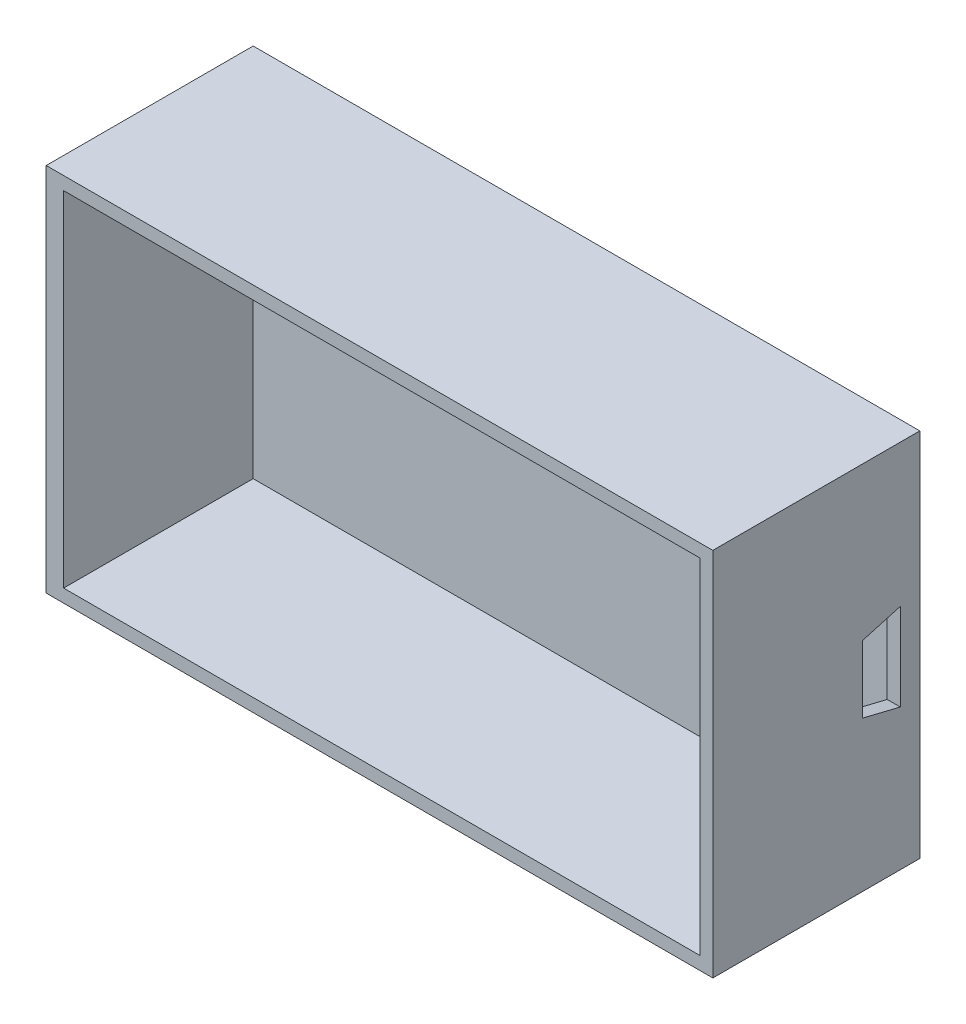
ISO-10303-21;
HEADER;
FILE_DESCRIPTION(('STEP AP214'),'2;1');
FILE_NAME('part.step','',(''),(''),'','','');
FILE_SCHEMA(('AUTOMOTIVE_DESIGN { 1 0 10303 214 1 1 1 1 }'));
ENDSEC;
DATA;
#1=APPLICATION_CONTEXT('core data for automotive mechanical design processes');
#2=APPLICATION_PROTOCOL_DEFINITION('international standard','automotive_design',2000,#1);
#3=PRODUCT_CONTEXT('',#1,'mechanical');
#4=PRODUCT('Part','Part','',(#3));
#5=PRODUCT_RELATED_PRODUCT_CATEGORY('part','',(#4));
#6=PRODUCT_DEFINITION_FORMATION('','',#4);
#7=PRODUCT_DEFINITION_CONTEXT('part definition',#1,'design');
#8=PRODUCT_DEFINITION('design','',#6,#7);
#9=PRODUCT_DEFINITION_SHAPE('','',#8);
#10=(LENGTH_UNIT() NAMED_UNIT(*) SI_UNIT(.MILLI.,.METRE.));
#11=(NAMED_UNIT(*) PLANE_ANGLE_UNIT() SI_UNIT($,.RADIAN.));
#12=(NAMED_UNIT(*) SI_UNIT($,.STERADIAN.) SOLID_ANGLE_UNIT());
#13=UNCERTAINTY_MEASURE_WITH_UNIT(LENGTH_MEASURE(1.E-05),#10,'distance_accuracy_value','');
#14=(GEOMETRIC_REPRESENTATION_CONTEXT(3) GLOBAL_UNCERTAINTY_ASSIGNED_CONTEXT((#13)) GLOBAL_UNIT_ASSIGNED_CONTEXT((#10,
#11,#12)) REPRESENTATION_CONTEXT('',''));
#15=CARTESIAN_POINT('',(0.,0.,0.));
#16=DIRECTION('',(0.,0.,1.));
#17=DIRECTION('',(1.,0.,0.));
#18=AXIS2_PLACEMENT_3D('',#15,#16,#17);
#19=CARTESIAN_POINT('',(58.4,0.,19.));
#20=DIRECTION('',(0.,1.,0.));
#21=DIRECTION('',(0.,0.,1.));
#22=AXIS2_PLACEMENT_3D('',#19,#20,#21);
#23=PLANE('',#22);
#24=DIRECTION('',(0.,0.,-1.));
#25=VECTOR('',#24,1.);
#26=CARTESIAN_POINT('',(58.4,0.,19.));
#27=LINE('',#26,#25);
#28=CARTESIAN_POINT('',(58.4,0.,19.));
#29=VERTEX_POINT('',#28);
#30=CARTESIAN_POINT('',(58.4,0.,1.6));
#31=VERTEX_POINT('',#30);
#32=EDGE_CURVE('E212',#29,#31,#27,.T.);
#33=ORIENTED_EDGE('',*,*,#32,.T.);
#34=DIRECTION('',(1.,0.,0.));
#35=VECTOR('',#34,1.);
#36=CARTESIAN_POINT('',(58.4,0.,1.6));
#37=LINE('',#36,#35);
#38=CARTESIAN_POINT('',(0.,0.,1.6));
#39=VERTEX_POINT('',#38);
#40=EDGE_CURVE('E178',#39,#31,#37,.T.);
#41=ORIENTED_EDGE('',*,*,#40,.F.);
#42=DIRECTION('',(0.,0.,-1.));
#43=VECTOR('',#42,1.);
#44=CARTESIAN_POINT('',(0.,0.,19.));
#45=LINE('',#44,#43);
#46=CARTESIAN_POINT('',(0.,0.,19.));
#47=VERTEX_POINT('',#46);
#48=EDGE_CURVE('E200',#47,#39,#45,.T.);
#49=ORIENTED_EDGE('',*,*,#48,.F.);
#50=DIRECTION('',(1.,0.,0.));
#51=VECTOR('',#50,1.);
#52=CARTESIAN_POINT('',(58.4,0.,19.));
#53=LINE('',#52,#51);
#54=EDGE_CURVE('E187',#47,#29,#53,.T.);
#55=ORIENTED_EDGE('',*,*,#54,.T.);
#56=EDGE_LOOP('',(#33,#41,#49,#55));
#57=FACE_BOUND('',#56,.T.);
#58=ADVANCED_FACE('F39',(#57),#23,.T.);
#59=CARTESIAN_POINT('',(58.4,31.6,19.));
#60=DIRECTION('',(-1.,0.,0.));
#61=DIRECTION('',(0.,0.,1.));
#62=AXIS2_PLACEMENT_3D('',#59,#60,#61);
#63=PLANE('',#62);
#64=DIRECTION('',(0.,-1.,0.));
#65=VECTOR('',#64,1.);
#66=CARTESIAN_POINT('',(58.4,31.6,1.79014940310975));
#67=LINE('',#66,#65);
#68=CARTESIAN_POINT('',(58.4,19.7419828381159,1.79014940310974));
#69=VERTEX_POINT('',#68);
#70=CARTESIAN_POINT('',(58.4,11.7419828381159,1.79014940310974));
#71=VERTEX_POINT('',#70);
#72=EDGE_CURVE('E172',#69,#71,#67,.T.);
#73=ORIENTED_EDGE('',*,*,#72,.F.);
#74=DIRECTION('',(0.,0.2723630723258,-0.962194552485749));
#75=VECTOR('',#74,1.);
#76=CARTESIAN_POINT('',(58.4,16.1115087775231,14.6157587421932));
#77=LINE('',#76,#75);
#78=CARTESIAN_POINT('',(58.4,18.7544498385254,5.27887077965979));
#79=VERTEX_POINT('',#78);
#80=EDGE_CURVE('E160',#79,#69,#77,.T.);
#81=ORIENTED_EDGE('',*,*,#80,.F.);
#82=DIRECTION('',(0.,1.,0.));
#83=VECTOR('',#82,1.);
#84=CARTESIAN_POINT('',(58.4,31.6,5.27887077965979));
#85=LINE('',#84,#83);
#86=CARTESIAN_POINT('',(58.4,12.594196568005,5.27887077965978));
#87=VERTEX_POINT('',#86);
#88=EDGE_CURVE('E135',#87,#79,#85,.T.);
#89=ORIENTED_EDGE('',*,*,#88,.F.);
#90=DIRECTION('',(0.,0.237299423470381,0.97143655666267));
#91=VECTOR('',#90,1.);
#92=CARTESIAN_POINT('',(58.4,16.8274456996713,22.608592444468));
#93=LINE('',#92,#91);
#94=EDGE_CURVE('E169',#71,#87,#93,.T.);
#95=ORIENTED_EDGE('',*,*,#94,.F.);
#96=EDGE_LOOP('',(#73,#81,#89,#95));
#97=FACE_BOUND('',#96,.T.);
#98=DIRECTION('',(0.,0.,-1.));
#99=VECTOR('',#98,1.);
#100=CARTESIAN_POINT('',(58.4,31.6,19.));
#101=LINE('',#100,#99);
#102=CARTESIAN_POINT('',(58.4,31.6,19.));
#103=VERTEX_POINT('',#102);
#104=CARTESIAN_POINT('',(58.4,31.6,1.6));
#105=VERTEX_POINT('',#104);
#106=EDGE_CURVE('E208',#103,#105,#101,.T.);
#107=ORIENTED_EDGE('',*,*,#106,.T.);
#108=DIRECTION('',(0.,1.,0.));
#109=VECTOR('',#108,1.);
#110=CARTESIAN_POINT('',(58.4,31.6,1.6));
#111=LINE('',#110,#109);
#112=EDGE_CURVE('E181',#31,#105,#111,.T.);
#113=ORIENTED_EDGE('',*,*,#112,.F.);
#114=ORIENTED_EDGE('',*,*,#32,.F.);
#115=DIRECTION('',(0.,1.,0.));
#116=VECTOR('',#115,1.);
#117=CARTESIAN_POINT('',(58.4,31.6,19.));
#118=LINE('',#117,#116);
#119=EDGE_CURVE('E190',#29,#103,#118,.T.);
#120=ORIENTED_EDGE('',*,*,#119,.T.);
#121=EDGE_LOOP('',(#107,#113,#114,#120));
#122=FACE_BOUND('',#121,.T.);
#123=ADVANCED_FACE('F284',(#97,#122),#63,.T.);
#124=CARTESIAN_POINT('',(0.,31.6,19.));
#125=DIRECTION('',(0.,-1.,0.));
#126=DIRECTION('',(0.,0.,-1.));
#127=AXIS2_PLACEMENT_3D('',#124,#125,#126);
#128=PLANE('',#127);
#129=DIRECTION('',(0.,0.,-1.));
#130=VECTOR('',#129,1.);
#131=CARTESIAN_POINT('',(0.,31.6,19.));
#132=LINE('',#131,#130);
#133=CARTESIAN_POINT('',(0.,31.6,19.));
#134=VERTEX_POINT('',#133);
#135=CARTESIAN_POINT('',(0.,31.6,1.6));
#136=VERTEX_POINT('',#135);
#137=EDGE_CURVE('E204',#134,#136,#132,.T.);
#138=ORIENTED_EDGE('',*,*,#137,.T.);
#139=DIRECTION('',(-1.,0.,0.));
#140=VECTOR('',#139,1.);
#141=CARTESIAN_POINT('',(0.,31.6,1.6));
#142=LINE('',#141,#140);
#143=EDGE_CURVE('E184',#105,#136,#142,.T.);
#144=ORIENTED_EDGE('',*,*,#143,.F.);
#145=ORIENTED_EDGE('',*,*,#106,.F.);
#146=DIRECTION('',(-1.,0.,0.));
#147=VECTOR('',#146,1.);
#148=CARTESIAN_POINT('',(0.,31.6,19.));
#149=LINE('',#148,#147);
#150=EDGE_CURVE('E193',#103,#134,#149,.T.);
#151=ORIENTED_EDGE('',*,*,#150,.T.);
#152=EDGE_LOOP('',(#138,#144,#145,#151));
#153=FACE_BOUND('',#152,.T.);
#154=ADVANCED_FACE('F291',(#153),#128,.T.);
#155=CARTESIAN_POINT('',(0.,0.,19.));
#156=DIRECTION('',(1.,0.,0.));
#157=DIRECTION('',(0.,0.,-1.));
#158=AXIS2_PLACEMENT_3D('',#155,#156,#157);
#159=PLANE('',#158);
#160=ORIENTED_EDGE('',*,*,#48,.T.);
#161=DIRECTION('',(0.,-1.,0.));
#162=VECTOR('',#161,1.);
#163=CARTESIAN_POINT('',(0.,0.,1.6));
#164=LINE('',#163,#162);
#165=EDGE_CURVE('E175',#136,#39,#164,.T.);
#166=ORIENTED_EDGE('',*,*,#165,.F.);
#167=ORIENTED_EDGE('',*,*,#137,.F.);
#168=DIRECTION('',(0.,-1.,0.));
#169=VECTOR('',#168,1.);
#170=CARTESIAN_POINT('',(0.,0.,19.));
#171=LINE('',#170,#169);
#172=EDGE_CURVE('E197',#134,#47,#171,.T.);
#173=ORIENTED_EDGE('',*,*,#172,.T.);
#174=EDGE_LOOP('',(#160,#166,#167,#173));
#175=FACE_BOUND('',#174,.T.);
#176=ADVANCED_FACE('F272',(#175),#159,.T.);
#177=CARTESIAN_POINT('',(0.,0.,19.));
#178=DIRECTION('',(0.,0.,-1.));
#179=DIRECTION('',(-1.,0.,0.));
#180=AXIS2_PLACEMENT_3D('',#177,#178,#179);
#181=PLANE('',#180);
#182=DIRECTION('',(1.,0.,0.));
#183=VECTOR('',#182,1.);
#184=CARTESIAN_POINT('',(59.6,-1.2,19.));
#185=LINE('',#184,#183);
#186=CARTESIAN_POINT('',(-1.6,-1.2,19.));
#187=VERTEX_POINT('',#186);
#188=CARTESIAN_POINT('',(59.6,-1.2,19.));
#189=VERTEX_POINT('',#188);
#190=EDGE_CURVE('E217',#187,#189,#185,.T.);
#191=ORIENTED_EDGE('',*,*,#190,.T.);
#192=DIRECTION('',(0.,1.,0.));
#193=VECTOR('',#192,1.);
#194=CARTESIAN_POINT('',(59.6,32.8,19.));
#195=LINE('',#194,#193);
#196=CARTESIAN_POINT('',(59.6,32.8,19.));
#197=VERTEX_POINT('',#196);
#198=EDGE_CURVE('E221',#189,#197,#195,.T.);
#199=ORIENTED_EDGE('',*,*,#198,.T.);
#200=DIRECTION('',(-1.,0.,0.));
#201=VECTOR('',#200,1.);
#202=CARTESIAN_POINT('',(0.,32.8,19.));
#203=LINE('',#202,#201);
#204=CARTESIAN_POINT('',(-1.6,32.8,19.));
#205=VERTEX_POINT('',#204);
#206=EDGE_CURVE('E225',#197,#205,#203,.T.);
#207=ORIENTED_EDGE('',*,*,#206,.T.);
#208=DIRECTION('',(0.,-1.,0.));
#209=VECTOR('',#208,1.);
#210=CARTESIAN_POINT('',(-1.6,-1.2,19.));
#211=LINE('',#210,#209);
#212=EDGE_CURVE('E228',#205,#187,#211,.T.);
#213=ORIENTED_EDGE('',*,*,#212,.T.);
#214=EDGE_LOOP('',(#191,#199,#207,#213));
#215=FACE_BOUND('',#214,.T.);
#216=ORIENTED_EDGE('',*,*,#54,.F.);
#217=ORIENTED_EDGE('',*,*,#172,.F.);
#218=ORIENTED_EDGE('',*,*,#150,.F.);
#219=ORIENTED_EDGE('',*,*,#119,.F.);
#220=EDGE_LOOP('',(#216,#217,#218,#219));
#221=FACE_BOUND('',#220,.T.);
#222=ADVANCED_FACE('F269',(#215,#221),#181,.F.);
#223=CARTESIAN_POINT('',(0.,0.,0.));
#224=DIRECTION('',(0.,0.,-1.));
#225=DIRECTION('',(-1.,0.,0.));
#226=AXIS2_PLACEMENT_3D('',#223,#224,#225);
#227=PLANE('',#226);
#228=DIRECTION('',(1.,0.,0.));
#229=VECTOR('',#228,1.);
#230=CARTESIAN_POINT('',(59.6,-1.2,0.));
#231=LINE('',#230,#229);
#232=CARTESIAN_POINT('',(-1.6,-1.2,0.));
#233=VERTEX_POINT('',#232);
#234=CARTESIAN_POINT('',(59.6,-1.2,0.));
#235=VERTEX_POINT('',#234);
#236=EDGE_CURVE('E216',#233,#235,#231,.T.);
#237=ORIENTED_EDGE('',*,*,#236,.F.);
#238=DIRECTION('',(0.,-1.,0.));
#239=VECTOR('',#238,1.);
#240=CARTESIAN_POINT('',(-1.6,-1.2,0.));
#241=LINE('',#240,#239);
#242=CARTESIAN_POINT('',(-1.6,32.8,0.));
#243=VERTEX_POINT('',#242);
#244=EDGE_CURVE('E222',#243,#233,#241,.T.);
#245=ORIENTED_EDGE('',*,*,#244,.F.);
#246=DIRECTION('',(-1.,0.,0.));
#247=VECTOR('',#246,1.);
#248=CARTESIAN_POINT('',(-1.6,32.8,0.));
#249=LINE('',#248,#247);
#250=CARTESIAN_POINT('',(59.6,32.8,0.));
#251=VERTEX_POINT('',#250);
#252=EDGE_CURVE('E239',#251,#243,#249,.T.);
#253=ORIENTED_EDGE('',*,*,#252,.F.);
#254=DIRECTION('',(0.,1.,0.));
#255=VECTOR('',#254,1.);
#256=CARTESIAN_POINT('',(59.6,32.8,0.));
#257=LINE('',#256,#255);
#258=EDGE_CURVE('E235',#235,#251,#257,.T.);
#259=ORIENTED_EDGE('',*,*,#258,.F.);
#260=EDGE_LOOP('',(#237,#245,#253,#259));
#261=FACE_BOUND('',#260,.T.);
#262=ADVANCED_FACE('F260',(#261),#227,.T.);
#263=CARTESIAN_POINT('',(59.6,-1.2,19.));
#264=DIRECTION('',(0.,1.,0.));
#265=DIRECTION('',(0.,0.,1.));
#266=AXIS2_PLACEMENT_3D('',#263,#264,#265);
#267=PLANE('',#266);
#268=ORIENTED_EDGE('',*,*,#236,.T.);
#269=DIRECTION('',(0.,0.,-1.));
#270=VECTOR('',#269,1.);
#271=CARTESIAN_POINT('',(59.6,-1.2,19.));
#272=LINE('',#271,#270);
#273=EDGE_CURVE('E11',#189,#235,#272,.T.);
#274=ORIENTED_EDGE('',*,*,#273,.F.);
#275=ORIENTED_EDGE('',*,*,#190,.F.);
#276=DIRECTION('',(0.,0.,-1.));
#277=VECTOR('',#276,1.);
#278=CARTESIAN_POINT('',(-1.6,-1.2,19.));
#279=LINE('',#278,#277);
#280=EDGE_CURVE('E231',#187,#233,#279,.T.);
#281=ORIENTED_EDGE('',*,*,#280,.T.);
#282=EDGE_LOOP('',(#268,#274,#275,#281));
#283=FACE_BOUND('',#282,.T.);
#284=ADVANCED_FACE('F41',(#283),#267,.F.);
#285=CARTESIAN_POINT('',(59.6,32.8,19.));
#286=DIRECTION('',(-1.,0.,0.));
#287=DIRECTION('',(0.,0.,1.));
#288=AXIS2_PLACEMENT_3D('',#285,#286,#287);
#289=PLANE('',#288);
#290=DIRECTION('',(0.,-0.2723630723258,0.962194552485749));
#291=VECTOR('',#290,1.);
#292=CARTESIAN_POINT('',(59.6,16.2005267493232,14.301279224805));
#293=LINE('',#292,#291);
#294=CARTESIAN_POINT('',(59.6,19.7419828381159,1.79014940310974));
#295=VERTEX_POINT('',#294);
#296=CARTESIAN_POINT('',(59.6,18.7544498385254,5.27887077965979));
#297=VERTEX_POINT('',#296);
#298=EDGE_CURVE('E142',#295,#297,#293,.T.);
#299=ORIENTED_EDGE('',*,*,#298,.F.);
#300=DIRECTION('',(0.,1.,0.));
#301=VECTOR('',#300,1.);
#302=CARTESIAN_POINT('',(59.6,32.8,1.79014940310975));
#303=LINE('',#302,#301);
#304=CARTESIAN_POINT('',(59.6,11.7419828381159,1.79014940310974));
#305=VERTEX_POINT('',#304);
#306=EDGE_CURVE('E63',#305,#295,#303,.T.);
#307=ORIENTED_EDGE('',*,*,#306,.F.);
#308=DIRECTION('',(0.,-0.237299423470381,-0.97143655666267));
#309=VECTOR('',#308,1.);
#310=CARTESIAN_POINT('',(59.6,16.8950189193266,22.8852180462689));
#311=LINE('',#310,#309);
#312=CARTESIAN_POINT('',(59.6,12.594196568005,5.27887077965978));
#313=VERTEX_POINT('',#312);
#314=EDGE_CURVE('E150',#313,#305,#311,.T.);
#315=ORIENTED_EDGE('',*,*,#314,.F.);
#316=DIRECTION('',(0.,-1.,0.));
#317=VECTOR('',#316,1.);
#318=CARTESIAN_POINT('',(59.6,32.8,5.27887077965979));
#319=LINE('',#318,#317);
#320=EDGE_CURVE('E132',#297,#313,#319,.T.);
#321=ORIENTED_EDGE('',*,*,#320,.F.);
#322=EDGE_LOOP('',(#299,#307,#315,#321));
#323=FACE_BOUND('',#322,.T.);
#324=ORIENTED_EDGE('',*,*,#258,.T.);
#325=DIRECTION('',(0.,0.,-1.));
#326=VECTOR('',#325,1.);
#327=CARTESIAN_POINT('',(59.6,32.8,19.));
#328=LINE('',#327,#326);
#329=EDGE_CURVE('E48',#197,#251,#328,.T.);
#330=ORIENTED_EDGE('',*,*,#329,.F.);
#331=ORIENTED_EDGE('',*,*,#198,.F.);
#332=ORIENTED_EDGE('',*,*,#273,.T.);
#333=EDGE_LOOP('',(#324,#330,#331,#332));
#334=FACE_BOUND('',#333,.T.);
#335=ADVANCED_FACE('F147',(#323,#334),#289,.F.);
#336=CARTESIAN_POINT('',(-1.6,32.8,19.));
#337=DIRECTION('',(0.,-1.,0.));
#338=DIRECTION('',(0.,0.,-1.));
#339=AXIS2_PLACEMENT_3D('',#336,#337,#338);
#340=PLANE('',#339);
#341=ORIENTED_EDGE('',*,*,#252,.T.);
#342=DIRECTION('',(0.,0.,-1.));
#343=VECTOR('',#342,1.);
#344=CARTESIAN_POINT('',(-1.6,32.8,19.));
#345=LINE('',#344,#343);
#346=EDGE_CURVE('E247',#205,#243,#345,.T.);
#347=ORIENTED_EDGE('',*,*,#346,.F.);
#348=ORIENTED_EDGE('',*,*,#206,.F.);
#349=ORIENTED_EDGE('',*,*,#329,.T.);
#350=EDGE_LOOP('',(#341,#347,#348,#349));
#351=FACE_BOUND('',#350,.T.);
#352=ADVANCED_FACE('F255',(#351),#340,.F.);
#353=CARTESIAN_POINT('',(-1.6,-1.2,19.));
#354=DIRECTION('',(1.,0.,0.));
#355=DIRECTION('',(0.,0.,-1.));
#356=AXIS2_PLACEMENT_3D('',#353,#354,#355);
#357=PLANE('',#356);
#358=ORIENTED_EDGE('',*,*,#244,.T.);
#359=ORIENTED_EDGE('',*,*,#280,.F.);
#360=ORIENTED_EDGE('',*,*,#212,.F.);
#361=ORIENTED_EDGE('',*,*,#346,.T.);
#362=EDGE_LOOP('',(#358,#359,#360,#361));
#363=FACE_BOUND('',#362,.T.);
#364=ADVANCED_FACE('F264',(#363),#357,.F.);
#365=CARTESIAN_POINT('',(0.,0.,1.6));
#366=DIRECTION('',(0.,0.,-1.));
#367=DIRECTION('',(-1.,0.,0.));
#368=AXIS2_PLACEMENT_3D('',#365,#366,#367);
#369=PLANE('',#368);
#370=ORIENTED_EDGE('',*,*,#165,.T.);
#371=ORIENTED_EDGE('',*,*,#40,.T.);
#372=ORIENTED_EDGE('',*,*,#112,.T.);
#373=ORIENTED_EDGE('',*,*,#143,.T.);
#374=EDGE_LOOP('',(#370,#371,#372,#373));
#375=FACE_BOUND('',#374,.T.);
#376=ADVANCED_FACE('F288',(#375),#369,.F.);
#377=CARTESIAN_POINT('',(56.6,32.8,1.79014940310975));
#378=DIRECTION('',(0.,0.,-1.));
#379=DIRECTION('',(0.,1.,0.));
#380=AXIS2_PLACEMENT_3D('',#377,#378,#379);
#381=PLANE('',#380);
#382=ORIENTED_EDGE('',*,*,#72,.T.);
#383=DIRECTION('',(1.,0.,0.));
#384=VECTOR('',#383,1.);
#385=CARTESIAN_POINT('',(56.6,11.7419828381159,1.79014940310974));
#386=LINE('',#385,#384);
#387=EDGE_CURVE('E157',#71,#305,#386,.T.);
#388=ORIENTED_EDGE('',*,*,#387,.T.);
#389=ORIENTED_EDGE('',*,*,#306,.T.);
#390=DIRECTION('',(1.,0.,0.));
#391=VECTOR('',#390,1.);
#392=CARTESIAN_POINT('',(56.6,19.7419828381159,1.79014940310974));
#393=LINE('',#392,#391);
#394=EDGE_CURVE('E139',#69,#295,#393,.T.);
#395=ORIENTED_EDGE('',*,*,#394,.F.);
#396=EDGE_LOOP('',(#382,#388,#389,#395));
#397=FACE_BOUND('',#396,.T.);
#398=ADVANCED_FACE('F379',(#397),#381,.F.);
#399=CARTESIAN_POINT('',(56.6,16.8950189193266,22.8852180462689));
#400=DIRECTION('',(0.,-0.97143655666267,0.237299423470381));
#401=DIRECTION('',(0.,-0.237299423470381,-0.97143655666267));
#402=AXIS2_PLACEMENT_3D('',#399,#400,#401);
#403=PLANE('',#402);
#404=ORIENTED_EDGE('',*,*,#94,.T.);
#405=DIRECTION('',(1.,0.,0.));
#406=VECTOR('',#405,1.);
#407=CARTESIAN_POINT('',(56.6,12.594196568005,5.27887077965978));
#408=LINE('',#407,#406);
#409=EDGE_CURVE('E138',#87,#313,#408,.T.);
#410=ORIENTED_EDGE('',*,*,#409,.T.);
#411=ORIENTED_EDGE('',*,*,#314,.T.);
#412=ORIENTED_EDGE('',*,*,#387,.F.);
#413=EDGE_LOOP('',(#404,#410,#411,#412));
#414=FACE_BOUND('',#413,.T.);
#415=ADVANCED_FACE('F388',(#414),#403,.F.);
#416=CARTESIAN_POINT('',(56.6,32.8,5.27887077965979));
#417=DIRECTION('',(0.,0.,1.));
#418=DIRECTION('',(1.,0.,0.));
#419=AXIS2_PLACEMENT_3D('',#416,#417,#418);
#420=PLANE('',#419);
#421=ORIENTED_EDGE('',*,*,#88,.T.);
#422=DIRECTION('',(1.,0.,0.));
#423=VECTOR('',#422,1.);
#424=CARTESIAN_POINT('',(56.6,18.7544498385254,5.27887077965979));
#425=LINE('',#424,#423);
#426=EDGE_CURVE('E55',#79,#297,#425,.T.);
#427=ORIENTED_EDGE('',*,*,#426,.T.);
#428=ORIENTED_EDGE('',*,*,#320,.T.);
#429=ORIENTED_EDGE('',*,*,#409,.F.);
#430=EDGE_LOOP('',(#421,#427,#428,#429));
#431=FACE_BOUND('',#430,.T.);
#432=ADVANCED_FACE('F129',(#431),#420,.F.);
#433=CARTESIAN_POINT('',(56.6,16.2005267493232,14.301279224805));
#434=DIRECTION('',(0.,0.962194552485749,0.2723630723258));
#435=DIRECTION('',(0.,-0.2723630723258,0.962194552485749));
#436=AXIS2_PLACEMENT_3D('',#433,#434,#435);
#437=PLANE('',#436);
#438=ORIENTED_EDGE('',*,*,#80,.T.);
#439=ORIENTED_EDGE('',*,*,#394,.T.);
#440=ORIENTED_EDGE('',*,*,#298,.T.);
#441=ORIENTED_EDGE('',*,*,#426,.F.);
#442=EDGE_LOOP('',(#438,#439,#440,#441));
#443=FACE_BOUND('',#442,.T.);
#444=ADVANCED_FACE('F143',(#443),#437,.F.);
#445=CLOSED_SHELL('',(#58,#123,#154,#176,#222,#262,#284,#335,#352,#364,#376,#398,#415,#432,#444));
#446=MANIFOLD_SOLID_BREP('B2',#445);
#447=ADVANCED_BREP_SHAPE_REPRESENTATION('',(#18,#446),#14);
#448=SHAPE_DEFINITION_REPRESENTATION(#9,#447);
ENDSEC;
END-ISO-10303-21;
